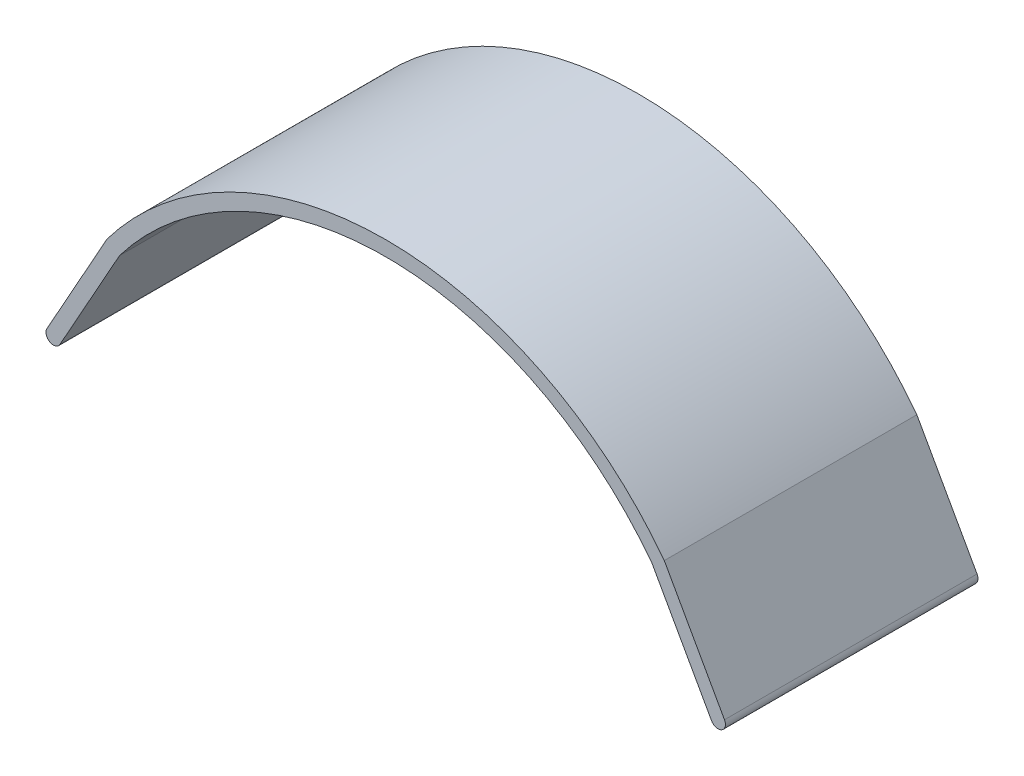
ISO-10303-21;
HEADER;
FILE_DESCRIPTION(('STEP AP214'),'2;1');
FILE_NAME('part.step','',(''),(''),'','','');
FILE_SCHEMA(('AUTOMOTIVE_DESIGN { 1 0 10303 214 1 1 1 1 }'));
ENDSEC;
DATA;
#1=APPLICATION_CONTEXT('core data for automotive mechanical design processes');
#2=APPLICATION_PROTOCOL_DEFINITION('international standard','automotive_design',2000,#1);
#3=PRODUCT_CONTEXT('',#1,'mechanical');
#4=PRODUCT('Part','Part','',(#3));
#5=PRODUCT_RELATED_PRODUCT_CATEGORY('part','',(#4));
#6=PRODUCT_DEFINITION_FORMATION('','',#4);
#7=PRODUCT_DEFINITION_CONTEXT('part definition',#1,'design');
#8=PRODUCT_DEFINITION('design','',#6,#7);
#9=PRODUCT_DEFINITION_SHAPE('','',#8);
#10=(LENGTH_UNIT() NAMED_UNIT(*) SI_UNIT(.MILLI.,.METRE.));
#11=(NAMED_UNIT(*) PLANE_ANGLE_UNIT() SI_UNIT($,.RADIAN.));
#12=(NAMED_UNIT(*) SI_UNIT($,.STERADIAN.) SOLID_ANGLE_UNIT());
#13=UNCERTAINTY_MEASURE_WITH_UNIT(LENGTH_MEASURE(1.E-05),#10,'distance_accuracy_value','');
#14=(GEOMETRIC_REPRESENTATION_CONTEXT(3) GLOBAL_UNCERTAINTY_ASSIGNED_CONTEXT((#13)) GLOBAL_UNIT_ASSIGNED_CONTEXT((#10,
#11,#12)) REPRESENTATION_CONTEXT('',''));
#15=CARTESIAN_POINT('',(0.,0.,0.));
#16=DIRECTION('',(0.,0.,1.));
#17=DIRECTION('',(1.,0.,0.));
#18=AXIS2_PLACEMENT_3D('',#15,#16,#17);
#19=CARTESIAN_POINT('',(65.,3.,-32.));
#20=DIRECTION('',(0.,0.,1.));
#21=DIRECTION('',(1.,0.,0.));
#22=AXIS2_PLACEMENT_3D('',#19,#20,#21);
#23=CYLINDRICAL_SURFACE('',#22,47.);
#24=DIRECTION('',(0.,0.,1.));
#25=VECTOR('',#24,1.);
#26=CARTESIAN_POINT('',(27.5,31.3328431330144,-32.));
#27=LINE('',#26,#25);
#28=CARTESIAN_POINT('',(27.5,31.3328431330144,-32.));
#29=VERTEX_POINT('',#28);
#30=CARTESIAN_POINT('',(27.5,31.3328431330144,2.));
#31=VERTEX_POINT('',#30);
#32=EDGE_CURVE('E36',#29,#31,#27,.T.);
#33=ORIENTED_EDGE('',*,*,#32,.T.);
#34=CARTESIAN_POINT('',(65.,3.,2.));
#35=DIRECTION('',(0.,0.,1.));
#36=DIRECTION('',(1.,0.,0.));
#37=AXIS2_PLACEMENT_3D('',#34,#35,#36);
#38=CIRCLE('',#37,47.);
#39=CARTESIAN_POINT('',(102.5,31.3328431330144,2.));
#40=VERTEX_POINT('',#39);
#41=EDGE_CURVE('E97',#40,#31,#38,.T.);
#42=ORIENTED_EDGE('',*,*,#41,.F.);
#43=DIRECTION('',(0.,0.,1.));
#44=VECTOR('',#43,1.);
#45=CARTESIAN_POINT('',(102.5,31.3328431330144,-32.));
#46=LINE('',#45,#44);
#47=CARTESIAN_POINT('',(102.5,31.3328431330144,-32.));
#48=VERTEX_POINT('',#47);
#49=EDGE_CURVE('E11',#48,#40,#46,.T.);
#50=ORIENTED_EDGE('',*,*,#49,.F.);
#51=CARTESIAN_POINT('',(65.,3.,-32.));
#52=DIRECTION('',(0.,0.,1.));
#53=DIRECTION('',(1.,0.,0.));
#54=AXIS2_PLACEMENT_3D('',#51,#52,#53);
#55=CIRCLE('',#54,47.);
#56=EDGE_CURVE('E98',#48,#29,#55,.T.);
#57=ORIENTED_EDGE('',*,*,#56,.T.);
#58=EDGE_LOOP('',(#33,#42,#50,#57));
#59=FACE_BOUND('',#58,.T.);
#60=ADVANCED_FACE('F33',(#59),#23,.T.);
#61=CARTESIAN_POINT('',(102.5,31.3328431330144,-32.));
#62=DIRECTION('',(0.873056537634652,0.487618992752942,0.));
#63=DIRECTION('',(-0.487618992752942,0.873056537634652,0.));
#64=AXIS2_PLACEMENT_3D('',#61,#62,#63);
#65=PLANE('',#64);
#66=ORIENTED_EDGE('',*,*,#49,.T.);
#67=DIRECTION('',(-0.487618992752942,0.873056537634652,0.));
#68=VECTOR('',#67,1.);
#69=CARTESIAN_POINT('',(102.5,31.3328431330144,2.));
#70=LINE('',#69,#68);
#71=CARTESIAN_POINT('',(110.605952254567,16.8195556795262,2.));
#72=VERTEX_POINT('',#71);
#73=EDGE_CURVE('E115',#72,#40,#70,.T.);
#74=ORIENTED_EDGE('',*,*,#73,.F.);
#75=DIRECTION('',(0.,0.,1.));
#76=VECTOR('',#75,1.);
#77=CARTESIAN_POINT('',(110.605952254567,16.8195556795262,-32.));
#78=LINE('',#77,#76);
#79=CARTESIAN_POINT('',(110.605952254567,16.8195556795262,-32.));
#80=VERTEX_POINT('',#79);
#81=EDGE_CURVE('E41',#80,#72,#78,.T.);
#82=ORIENTED_EDGE('',*,*,#81,.F.);
#83=DIRECTION('',(-0.487618992752942,0.873056537634652,0.));
#84=VECTOR('',#83,1.);
#85=CARTESIAN_POINT('',(102.5,31.3328431330144,-32.));
#86=LINE('',#85,#84);
#87=EDGE_CURVE('E103',#80,#48,#86,.T.);
#88=ORIENTED_EDGE('',*,*,#87,.T.);
#89=EDGE_LOOP('',(#66,#74,#82,#88));
#90=FACE_BOUND('',#89,.T.);
#91=ADVANCED_FACE('F179',(#90),#65,.T.);
#92=CARTESIAN_POINT('',(109.732895716932,16.3319366867732,-32.));
#93=DIRECTION('',(0.,0.,1.));
#94=DIRECTION('',(1.,0.,0.));
#95=AXIS2_PLACEMENT_3D('',#92,#93,#94);
#96=CYLINDRICAL_SURFACE('',#95,0.999999999999998);
#97=ORIENTED_EDGE('',*,*,#81,.T.);
#98=CARTESIAN_POINT('',(109.732895716932,16.3319366867732,2.));
#99=DIRECTION('',(0.,0.,1.));
#100=DIRECTION('',(-1.,0.,0.));
#101=AXIS2_PLACEMENT_3D('',#98,#99,#100);
#102=CIRCLE('',#101,0.999999999999998);
#103=CARTESIAN_POINT('',(108.859839179297,15.8443176940203,2.));
#104=VERTEX_POINT('',#103);
#105=EDGE_CURVE('E128',#104,#72,#102,.T.);
#106=ORIENTED_EDGE('',*,*,#105,.F.);
#107=DIRECTION('',(0.,0.,1.));
#108=VECTOR('',#107,1.);
#109=CARTESIAN_POINT('',(108.859839179297,15.8443176940203,-32.));
#110=LINE('',#109,#108);
#111=CARTESIAN_POINT('',(108.859839179297,15.8443176940203,-32.));
#112=VERTEX_POINT('',#111);
#113=EDGE_CURVE('E150',#112,#104,#110,.T.);
#114=ORIENTED_EDGE('',*,*,#113,.F.);
#115=CARTESIAN_POINT('',(109.732895716932,16.3319366867732,-32.));
#116=DIRECTION('',(0.,0.,1.));
#117=DIRECTION('',(-1.,0.,0.));
#118=AXIS2_PLACEMENT_3D('',#115,#116,#117);
#119=CIRCLE('',#118,0.999999999999998);
#120=EDGE_CURVE('E146',#112,#80,#119,.T.);
#121=ORIENTED_EDGE('',*,*,#120,.T.);
#122=EDGE_LOOP('',(#97,#106,#114,#121));
#123=FACE_BOUND('',#122,.T.);
#124=ADVANCED_FACE('F178',(#123),#96,.T.);
#125=CARTESIAN_POINT('',(100.821862297679,30.235898764794,-32.));
#126=DIRECTION('',(-0.873056537634652,-0.487618992752942,0.));
#127=DIRECTION('',(0.487618992752941,-0.873056537634652,0.));
#128=AXIS2_PLACEMENT_3D('',#125,#126,#127);
#129=PLANE('',#128);
#130=ORIENTED_EDGE('',*,*,#113,.T.);
#131=DIRECTION('',(0.487618992752941,-0.873056537634652,0.));
#132=VECTOR('',#131,1.);
#133=CARTESIAN_POINT('',(100.821862297679,30.235898764794,2.));
#134=LINE('',#133,#132);
#135=CARTESIAN_POINT('',(100.821862297679,30.235898764794,2.));
#136=VERTEX_POINT('',#135);
#137=EDGE_CURVE('E125',#136,#104,#134,.T.);
#138=ORIENTED_EDGE('',*,*,#137,.F.);
#139=DIRECTION('',(0.,0.,1.));
#140=VECTOR('',#139,1.);
#141=CARTESIAN_POINT('',(100.821862297679,30.235898764794,-32.));
#142=LINE('',#141,#140);
#143=CARTESIAN_POINT('',(100.821862297679,30.235898764794,-32.));
#144=VERTEX_POINT('',#143);
#145=EDGE_CURVE('E152',#144,#136,#142,.T.);
#146=ORIENTED_EDGE('',*,*,#145,.F.);
#147=DIRECTION('',(0.487618992752941,-0.873056537634652,0.));
#148=VECTOR('',#147,1.);
#149=CARTESIAN_POINT('',(100.821862297679,30.235898764794,-32.));
#150=LINE('',#149,#148);
#151=EDGE_CURVE('E143',#144,#112,#150,.T.);
#152=ORIENTED_EDGE('',*,*,#151,.T.);
#153=EDGE_LOOP('',(#130,#138,#146,#152));
#154=FACE_BOUND('',#153,.T.);
#155=ADVANCED_FACE('F174',(#154),#129,.T.);
#156=CARTESIAN_POINT('',(65.,3.,-32.));
#157=DIRECTION('',(0.,0.,1.));
#158=DIRECTION('',(1.,0.,0.));
#159=AXIS2_PLACEMENT_3D('',#156,#157,#158);
#160=CYLINDRICAL_SURFACE('',#159,45.);
#161=ORIENTED_EDGE('',*,*,#145,.T.);
#162=CARTESIAN_POINT('',(65.,3.,2.));
#163=DIRECTION('',(0.,0.,-1.));
#164=DIRECTION('',(1.,0.,0.));
#165=AXIS2_PLACEMENT_3D('',#162,#163,#164);
#166=CIRCLE('',#165,45.);
#167=CARTESIAN_POINT('',(29.1781377023209,30.2358987647941,2.));
#168=VERTEX_POINT('',#167);
#169=EDGE_CURVE('E122',#168,#136,#166,.T.);
#170=ORIENTED_EDGE('',*,*,#169,.F.);
#171=DIRECTION('',(0.,0.,1.));
#172=VECTOR('',#171,1.);
#173=CARTESIAN_POINT('',(29.1781377023209,30.2358987647941,-32.));
#174=LINE('',#173,#172);
#175=CARTESIAN_POINT('',(29.1781377023209,30.2358987647941,-32.));
#176=VERTEX_POINT('',#175);
#177=EDGE_CURVE('E154',#176,#168,#174,.T.);
#178=ORIENTED_EDGE('',*,*,#177,.F.);
#179=CARTESIAN_POINT('',(65.,3.,-32.));
#180=DIRECTION('',(0.,0.,-1.));
#181=DIRECTION('',(1.,0.,0.));
#182=AXIS2_PLACEMENT_3D('',#179,#180,#181);
#183=CIRCLE('',#182,45.);
#184=EDGE_CURVE('E140',#176,#144,#183,.T.);
#185=ORIENTED_EDGE('',*,*,#184,.T.);
#186=EDGE_LOOP('',(#161,#170,#178,#185));
#187=FACE_BOUND('',#186,.T.);
#188=ADVANCED_FACE('F167',(#187),#160,.F.);
#189=CARTESIAN_POINT('',(21.1401608207026,15.8443176940203,-32.));
#190=DIRECTION('',(0.873056537634652,-0.487618992752942,0.));
#191=DIRECTION('',(0.487618992752942,0.873056537634652,0.));
#192=AXIS2_PLACEMENT_3D('',#189,#190,#191);
#193=PLANE('',#192);
#194=ORIENTED_EDGE('',*,*,#177,.T.);
#195=DIRECTION('',(0.487618992752942,0.873056537634652,0.));
#196=VECTOR('',#195,1.);
#197=CARTESIAN_POINT('',(21.1401608207026,15.8443176940203,2.));
#198=LINE('',#197,#196);
#199=CARTESIAN_POINT('',(21.1401608207026,15.8443176940203,2.));
#200=VERTEX_POINT('',#199);
#201=EDGE_CURVE('E119',#200,#168,#198,.T.);
#202=ORIENTED_EDGE('',*,*,#201,.F.);
#203=DIRECTION('',(0.,0.,1.));
#204=VECTOR('',#203,1.);
#205=CARTESIAN_POINT('',(21.1401608207026,15.8443176940203,-32.));
#206=LINE('',#205,#204);
#207=CARTESIAN_POINT('',(21.1401608207026,15.8443176940203,-32.));
#208=VERTEX_POINT('',#207);
#209=EDGE_CURVE('E156',#208,#200,#206,.T.);
#210=ORIENTED_EDGE('',*,*,#209,.F.);
#211=DIRECTION('',(0.487618992752942,0.873056537634652,0.));
#212=VECTOR('',#211,1.);
#213=CARTESIAN_POINT('',(21.1401608207026,15.8443176940203,-32.));
#214=LINE('',#213,#212);
#215=EDGE_CURVE('E137',#208,#176,#214,.T.);
#216=ORIENTED_EDGE('',*,*,#215,.T.);
#217=EDGE_LOOP('',(#194,#202,#210,#216));
#218=FACE_BOUND('',#217,.T.);
#219=ADVANCED_FACE('F164',(#218),#193,.T.);
#220=CARTESIAN_POINT('',(20.2671042830679,16.3319366867733,-32.));
#221=DIRECTION('',(0.,0.,1.));
#222=DIRECTION('',(1.,0.,0.));
#223=AXIS2_PLACEMENT_3D('',#220,#221,#222);
#224=CYLINDRICAL_SURFACE('',#223,0.999999999999999);
#225=ORIENTED_EDGE('',*,*,#209,.T.);
#226=CARTESIAN_POINT('',(20.2671042830679,16.3319366867733,2.));
#227=DIRECTION('',(0.,0.,1.));
#228=DIRECTION('',(1.,0.,0.));
#229=AXIS2_PLACEMENT_3D('',#226,#227,#228);
#230=CIRCLE('',#229,0.999999999999999);
#231=CARTESIAN_POINT('',(19.3940477454333,16.8195556795262,2.));
#232=VERTEX_POINT('',#231);
#233=EDGE_CURVE('E110',#232,#200,#230,.T.);
#234=ORIENTED_EDGE('',*,*,#233,.F.);
#235=DIRECTION('',(0.,0.,1.));
#236=VECTOR('',#235,1.);
#237=CARTESIAN_POINT('',(19.3940477454333,16.8195556795262,-32.));
#238=LINE('',#237,#236);
#239=CARTESIAN_POINT('',(19.3940477454333,16.8195556795262,-32.));
#240=VERTEX_POINT('',#239);
#241=EDGE_CURVE('E102',#240,#232,#238,.T.);
#242=ORIENTED_EDGE('',*,*,#241,.F.);
#243=CARTESIAN_POINT('',(20.2671042830679,16.3319366867733,-32.));
#244=DIRECTION('',(0.,0.,1.));
#245=DIRECTION('',(1.,0.,0.));
#246=AXIS2_PLACEMENT_3D('',#243,#244,#245);
#247=CIRCLE('',#246,0.999999999999999);
#248=EDGE_CURVE('E134',#240,#208,#247,.T.);
#249=ORIENTED_EDGE('',*,*,#248,.T.);
#250=EDGE_LOOP('',(#225,#234,#242,#249));
#251=FACE_BOUND('',#250,.T.);
#252=ADVANCED_FACE('F158',(#251),#224,.T.);
#253=CARTESIAN_POINT('',(19.3940477454333,16.8195556795262,-32.));
#254=DIRECTION('',(-0.873056537634652,0.487618992752942,0.));
#255=DIRECTION('',(-0.487618992752942,-0.873056537634652,0.));
#256=AXIS2_PLACEMENT_3D('',#253,#254,#255);
#257=PLANE('',#256);
#258=ORIENTED_EDGE('',*,*,#241,.T.);
#259=DIRECTION('',(-0.487618992752942,-0.873056537634652,0.));
#260=VECTOR('',#259,1.);
#261=CARTESIAN_POINT('',(19.3940477454333,16.8195556795262,2.));
#262=LINE('',#261,#260);
#263=EDGE_CURVE('E105',#31,#232,#262,.T.);
#264=ORIENTED_EDGE('',*,*,#263,.F.);
#265=ORIENTED_EDGE('',*,*,#32,.F.);
#266=DIRECTION('',(-0.487618992752942,-0.873056537634652,0.));
#267=VECTOR('',#266,1.);
#268=CARTESIAN_POINT('',(19.3940477454333,16.8195556795262,-32.));
#269=LINE('',#268,#267);
#270=EDGE_CURVE('E132',#29,#240,#269,.T.);
#271=ORIENTED_EDGE('',*,*,#270,.T.);
#272=EDGE_LOOP('',(#258,#264,#265,#271));
#273=FACE_BOUND('',#272,.T.);
#274=ADVANCED_FACE('F106',(#273),#257,.T.);
#275=CARTESIAN_POINT('',(65.,3.,-32.));
#276=DIRECTION('',(0.,0.,1.));
#277=DIRECTION('',(1.,0.,0.));
#278=AXIS2_PLACEMENT_3D('',#275,#276,#277);
#279=PLANE('',#278);
#280=ORIENTED_EDGE('',*,*,#56,.F.);
#281=ORIENTED_EDGE('',*,*,#87,.F.);
#282=ORIENTED_EDGE('',*,*,#120,.F.);
#283=ORIENTED_EDGE('',*,*,#151,.F.);
#284=ORIENTED_EDGE('',*,*,#184,.F.);
#285=ORIENTED_EDGE('',*,*,#215,.F.);
#286=ORIENTED_EDGE('',*,*,#248,.F.);
#287=ORIENTED_EDGE('',*,*,#270,.F.);
#288=EDGE_LOOP('',(#280,#281,#282,#283,#284,#285,#286,#287));
#289=FACE_BOUND('',#288,.T.);
#290=ADVANCED_FACE('F170',(#289),#279,.F.);
#291=CARTESIAN_POINT('',(65.,3.,2.));
#292=DIRECTION('',(0.,0.,1.));
#293=DIRECTION('',(1.,0.,0.));
#294=AXIS2_PLACEMENT_3D('',#291,#292,#293);
#295=PLANE('',#294);
#296=ORIENTED_EDGE('',*,*,#41,.T.);
#297=ORIENTED_EDGE('',*,*,#263,.T.);
#298=ORIENTED_EDGE('',*,*,#233,.T.);
#299=ORIENTED_EDGE('',*,*,#201,.T.);
#300=ORIENTED_EDGE('',*,*,#169,.T.);
#301=ORIENTED_EDGE('',*,*,#137,.T.);
#302=ORIENTED_EDGE('',*,*,#105,.T.);
#303=ORIENTED_EDGE('',*,*,#73,.T.);
#304=EDGE_LOOP('',(#296,#297,#298,#299,#300,#301,#302,#303));
#305=FACE_BOUND('',#304,.T.);
#306=ADVANCED_FACE('F113',(#305),#295,.T.);
#307=CLOSED_SHELL('',(#60,#91,#124,#155,#188,#219,#252,#274,#290,#306));
#308=MANIFOLD_SOLID_BREP('B2',#307);
#309=ADVANCED_BREP_SHAPE_REPRESENTATION('',(#18,#308),#14);
#310=SHAPE_DEFINITION_REPRESENTATION(#9,#309);
ENDSEC;
END-ISO-10303-21;
